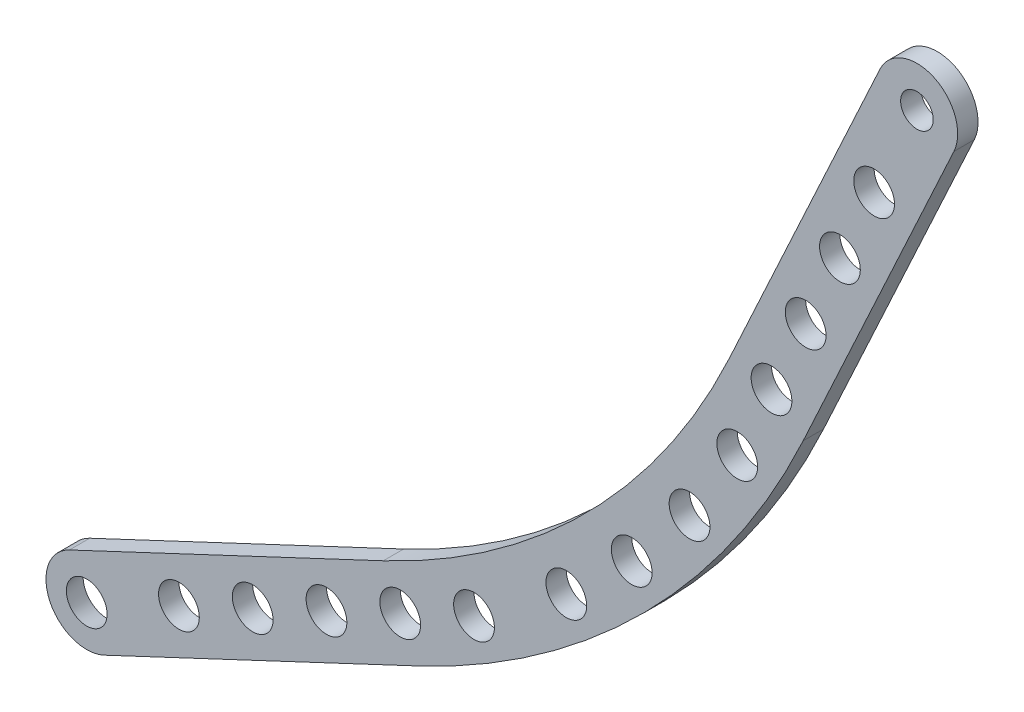
ISO-10303-21;
HEADER;
FILE_DESCRIPTION(('STEP AP214'),'2;1');
FILE_NAME('part.step','',(''),(''),'','','');
FILE_SCHEMA(('AUTOMOTIVE_DESIGN { 1 0 10303 214 1 1 1 1 }'));
ENDSEC;
DATA;
#1=APPLICATION_CONTEXT('core data for automotive mechanical design processes');
#2=APPLICATION_PROTOCOL_DEFINITION('international standard','automotive_design',2000,#1);
#3=PRODUCT_CONTEXT('',#1,'mechanical');
#4=PRODUCT('Part','Part','',(#3));
#5=PRODUCT_RELATED_PRODUCT_CATEGORY('part','',(#4));
#6=PRODUCT_DEFINITION_FORMATION('','',#4);
#7=PRODUCT_DEFINITION_CONTEXT('part definition',#1,'design');
#8=PRODUCT_DEFINITION('design','',#6,#7);
#9=PRODUCT_DEFINITION_SHAPE('','',#8);
#10=(LENGTH_UNIT() NAMED_UNIT(*) SI_UNIT(.MILLI.,.METRE.));
#11=(NAMED_UNIT(*) PLANE_ANGLE_UNIT() SI_UNIT($,.RADIAN.));
#12=(NAMED_UNIT(*) SI_UNIT($,.STERADIAN.) SOLID_ANGLE_UNIT());
#13=UNCERTAINTY_MEASURE_WITH_UNIT(LENGTH_MEASURE(1.E-05),#10,'distance_accuracy_value','');
#14=(GEOMETRIC_REPRESENTATION_CONTEXT(3) GLOBAL_UNCERTAINTY_ASSIGNED_CONTEXT((#13)) GLOBAL_UNIT_ASSIGNED_CONTEXT((#10,
#11,#12)) REPRESENTATION_CONTEXT('',''));
#15=CARTESIAN_POINT('',(0.,0.,0.));
#16=DIRECTION('',(0.,0.,1.));
#17=DIRECTION('',(1.,0.,0.));
#18=AXIS2_PLACEMENT_3D('',#15,#16,#17);
#19=CARTESIAN_POINT('',(-121.695991982311,85.2492767531801,5.));
#20=DIRECTION('',(0.,0.,1.));
#21=DIRECTION('',(1.,0.,0.));
#22=AXIS2_PLACEMENT_3D('',#19,#20,#21);
#23=PLANE('',#22);
#24=CARTESIAN_POINT('',(28.3199968643549,-26.7852290470118,5.));
#25=DIRECTION('',(0.,0.,1.));
#26=DIRECTION('',(1.,0.,0.));
#27=AXIS2_PLACEMENT_3D('',#24,#25,#26);
#28=CIRCLE('',#27,5.00000000000001);
#29=CARTESIAN_POINT('',(33.3199968643549,-26.7852290470118,5.));
#30=VERTEX_POINT('',#29);
#31=EDGE_CURVE('E278',#30,#30,#28,.T.);
#32=ORIENTED_EDGE('',*,*,#31,.F.);
#33=EDGE_LOOP('',(#32));
#34=FACE_BOUND('',#33,.T.);
#35=CARTESIAN_POINT('',(14.1430883994595,-43.6082866281407,5.));
#36=DIRECTION('',(0.,0.,1.));
#37=DIRECTION('',(1.,0.,0.));
#38=AXIS2_PLACEMENT_3D('',#35,#36,#37);
#39=CIRCLE('',#38,4.99999999999999);
#40=CARTESIAN_POINT('',(19.1430883994595,-43.6082866281407,5.));
#41=VERTEX_POINT('',#40);
#42=EDGE_CURVE('E280',#41,#41,#39,.T.);
#43=ORIENTED_EDGE('',*,*,#42,.F.);
#44=EDGE_LOOP('',(#43));
#45=FACE_BOUND('',#44,.T.);
#46=CARTESIAN_POINT('',(-1.90925154087765,-58.6523014659377,5.));
#47=DIRECTION('',(0.,0.,1.));
#48=DIRECTION('',(1.,0.,0.));
#49=AXIS2_PLACEMENT_3D('',#46,#47,#48);
#50=CIRCLE('',#49,5.00000000000001);
#51=CARTESIAN_POINT('',(3.09074845912236,-58.6523014659377,5.));
#52=VERTEX_POINT('',#51);
#53=EDGE_CURVE('E288',#52,#52,#50,.T.);
#54=ORIENTED_EDGE('',*,*,#53,.F.);
#55=EDGE_LOOP('',(#54));
#56=FACE_BOUND('',#55,.T.);
#57=CARTESIAN_POINT('',(-24.5574572514307,-74.6121337966154,5.));
#58=DIRECTION('',(0.,0.,1.));
#59=DIRECTION('',(1.,0.,0.));
#60=AXIS2_PLACEMENT_3D('',#57,#58,#59);
#61=CIRCLE('',#60,5.);
#62=CARTESIAN_POINT('',(-19.5574572514307,-74.6121337966154,5.));
#63=VERTEX_POINT('',#62);
#64=EDGE_CURVE('E294',#63,#63,#61,.T.);
#65=ORIENTED_EDGE('',*,*,#64,.F.);
#66=EDGE_LOOP('',(#65));
#67=FACE_BOUND('',#66,.T.);
#68=CARTESIAN_POINT('',(-42.656786955256,-83.1217909149856,5.));
#69=DIRECTION('',(0.,0.,1.));
#70=DIRECTION('',(1.,0.,0.));
#71=AXIS2_PLACEMENT_3D('',#68,#69,#70);
#72=CIRCLE('',#71,5.);
#73=CARTESIAN_POINT('',(-37.656786955256,-83.1217909149856,5.));
#74=VERTEX_POINT('',#73);
#75=EDGE_CURVE('E300',#74,#74,#72,.T.);
#76=ORIENTED_EDGE('',*,*,#75,.F.);
#77=EDGE_LOOP('',(#76));
#78=FACE_BOUND('',#77,.T.);
#79=CARTESIAN_POINT('',(-60.7561166590812,-91.6314480333558,5.));
#80=DIRECTION('',(0.,0.,1.));
#81=DIRECTION('',(1.,0.,0.));
#82=AXIS2_PLACEMENT_3D('',#79,#80,#81);
#83=CIRCLE('',#82,5.);
#84=CARTESIAN_POINT('',(-55.7561166590812,-91.6314480333558,5.));
#85=VERTEX_POINT('',#84);
#86=EDGE_CURVE('E306',#85,#85,#83,.T.);
#87=ORIENTED_EDGE('',*,*,#86,.F.);
#88=EDGE_LOOP('',(#87));
#89=FACE_BOUND('',#88,.T.);
#90=CARTESIAN_POINT('',(-78.8554463629065,-100.141105151726,5.));
#91=DIRECTION('',(0.,0.,1.));
#92=DIRECTION('',(1.,0.,0.));
#93=AXIS2_PLACEMENT_3D('',#90,#91,#92);
#94=CIRCLE('',#93,5.00000000000001);
#95=CARTESIAN_POINT('',(-73.8554463629065,-100.141105151726,5.));
#96=VERTEX_POINT('',#95);
#97=EDGE_CURVE('E312',#96,#96,#94,.T.);
#98=ORIENTED_EDGE('',*,*,#97,.F.);
#99=EDGE_LOOP('',(#98));
#100=FACE_BOUND('',#99,.T.);
#101=CARTESIAN_POINT('',(-96.9547760667318,-108.650762270096,5.));
#102=DIRECTION('',(0.,0.,1.));
#103=DIRECTION('',(1.,0.,0.));
#104=AXIS2_PLACEMENT_3D('',#101,#102,#103);
#105=CIRCLE('',#104,5.00000000000001);
#106=CARTESIAN_POINT('',(-91.9547760667318,-108.650762270096,5.));
#107=VERTEX_POINT('',#106);
#108=EDGE_CURVE('E318',#107,#107,#105,.T.);
#109=ORIENTED_EDGE('',*,*,#108,.F.);
#110=EDGE_LOOP('',(#109));
#111=FACE_BOUND('',#110,.T.);
#112=CARTESIAN_POINT('',(40.0319313664824,-8.16184078875237,5.));
#113=DIRECTION('',(0.,0.,1.));
#114=DIRECTION('',(1.,0.,0.));
#115=AXIS2_PLACEMENT_3D('',#112,#113,#114);
#116=CIRCLE('',#115,5.);
#117=CARTESIAN_POINT('',(45.0319313664824,-8.16184078875237,5.));
#118=VERTEX_POINT('',#117);
#119=EDGE_CURVE('E324',#118,#118,#116,.T.);
#120=ORIENTED_EDGE('',*,*,#119,.F.);
#121=EDGE_LOOP('',(#120));
#122=FACE_BOUND('',#121,.T.);
#123=CARTESIAN_POINT('',(48.4269201519066,9.99095963687346,5.));
#124=DIRECTION('',(0.,0.,1.));
#125=DIRECTION('',(1.,0.,0.));
#126=AXIS2_PLACEMENT_3D('',#123,#124,#125);
#127=CIRCLE('',#126,5.);
#128=CARTESIAN_POINT('',(53.4269201519066,9.99095963687346,5.));
#129=VERTEX_POINT('',#128);
#130=EDGE_CURVE('E330',#129,#129,#127,.T.);
#131=ORIENTED_EDGE('',*,*,#130,.F.);
#132=EDGE_LOOP('',(#131));
#133=FACE_BOUND('',#132,.T.);
#134=CARTESIAN_POINT('',(56.8219089373308,28.1437600624993,5.));
#135=DIRECTION('',(0.,0.,1.));
#136=DIRECTION('',(1.,0.,0.));
#137=AXIS2_PLACEMENT_3D('',#134,#135,#136);
#138=CIRCLE('',#137,5.);
#139=CARTESIAN_POINT('',(61.8219089373308,28.1437600624993,5.));
#140=VERTEX_POINT('',#139);
#141=EDGE_CURVE('E336',#140,#140,#138,.T.);
#142=ORIENTED_EDGE('',*,*,#141,.F.);
#143=EDGE_LOOP('',(#142));
#144=FACE_BOUND('',#143,.T.);
#145=CARTESIAN_POINT('',(65.216897722755,46.2965604881251,5.));
#146=DIRECTION('',(0.,0.,1.));
#147=DIRECTION('',(1.,0.,0.));
#148=AXIS2_PLACEMENT_3D('',#145,#146,#147);
#149=CIRCLE('',#148,5.00000000000001);
#150=CARTESIAN_POINT('',(70.216897722755,46.2965604881251,5.));
#151=VERTEX_POINT('',#150);
#152=EDGE_CURVE('E342',#151,#151,#149,.T.);
#153=ORIENTED_EDGE('',*,*,#152,.F.);
#154=EDGE_LOOP('',(#153));
#155=FACE_BOUND('',#154,.T.);
#156=CARTESIAN_POINT('',(73.6118865081792,64.449360913751,5.));
#157=DIRECTION('',(0.,0.,1.));
#158=DIRECTION('',(1.,0.,0.));
#159=AXIS2_PLACEMENT_3D('',#156,#157,#158);
#160=CIRCLE('',#159,5.00000000000001);
#161=CARTESIAN_POINT('',(78.6118865081792,64.449360913751,5.));
#162=VERTEX_POINT('',#161);
#163=EDGE_CURVE('E348',#162,#162,#160,.T.);
#164=ORIENTED_EDGE('',*,*,#163,.F.);
#165=EDGE_LOOP('',(#164));
#166=FACE_BOUND('',#165,.T.);
#167=CARTESIAN_POINT('',(84.1056224899598,87.1403614457831,5.));
#168=DIRECTION('',(0.,0.,1.));
#169=DIRECTION('',(1.,0.,0.));
#170=AXIS2_PLACEMENT_3D('',#167,#168,#169);
#171=CIRCLE('',#170,4.00000000000001);
#172=CARTESIAN_POINT('',(88.1056224899598,87.1403614457831,5.));
#173=VERTEX_POINT('',#172);
#174=EDGE_CURVE('E125',#173,#173,#171,.T.);
#175=ORIENTED_EDGE('',*,*,#174,.F.);
#176=EDGE_LOOP('',(#175));
#177=FACE_BOUND('',#176,.T.);
#178=CARTESIAN_POINT('',(-121.695991982311,85.2492767531801,5.));
#179=DIRECTION('',(0.,0.,1.));
#180=DIRECTION('',(1.,0.,0.));
#181=AXIS2_PLACEMENT_3D('',#178,#179,#180);
#182=CIRCLE('',#181,196.);
#183=CARTESIAN_POINT('',(-38.3013522222832,-92.1241543443077,5.));
#184=VERTEX_POINT('',#183);
#185=CARTESIAN_POINT('',(56.2014521888218,2.97838665602096,5.));
#186=VERTEX_POINT('',#185);
#187=EDGE_CURVE('E143',#184,#186,#182,.T.);
#188=ORIENTED_EDGE('',*,*,#187,.T.);
#189=DIRECTION('',(0.419749439271224,0.907640021281286,0.));
#190=VECTOR('',#189,1.);
#191=CARTESIAN_POINT('',(93.1820227027727,82.9428670530709,5.));
#192=LINE('',#191,#190);
#193=CARTESIAN_POINT('',(93.1820227027727,82.9428670530709,5.));
#194=VERTEX_POINT('',#193);
#195=EDGE_CURVE('E120',#186,#194,#192,.T.);
#196=ORIENTED_EDGE('',*,*,#195,.T.);
#197=CARTESIAN_POINT('',(84.1056224899598,87.1403614457831,5.));
#198=DIRECTION('',(0.,0.,1.));
#199=DIRECTION('',(1.,0.,0.));
#200=AXIS2_PLACEMENT_3D('',#197,#198,#199);
#201=CIRCLE('',#200,10.);
#202=CARTESIAN_POINT('',(75.029222277147,91.3378558384954,5.));
#203=VERTEX_POINT('',#202);
#204=EDGE_CURVE('E146',#194,#203,#201,.T.);
#205=ORIENTED_EDGE('',*,*,#204,.T.);
#206=DIRECTION('',(-0.419749439271224,-0.907640021281286,0.));
#207=VECTOR('',#206,1.);
#208=CARTESIAN_POINT('',(75.029222277147,91.3378558384954,5.));
#209=LINE('',#208,#207);
#210=CARTESIAN_POINT('',(38.0486517631959,11.3733754414452,5.));
#211=VERTEX_POINT('',#210);
#212=EDGE_CURVE('E148',#203,#211,#209,.T.);
#213=ORIENTED_EDGE('',*,*,#212,.T.);
#214=CARTESIAN_POINT('',(-121.695991982311,85.24927675318,5.));
#215=DIRECTION('',(0.,0.,-1.));
#216=DIRECTION('',(1.,0.,0.));
#217=AXIS2_PLACEMENT_3D('',#214,#215,#216);
#218=CIRCLE('',#217,176.);
#219=CARTESIAN_POINT('',(-46.8110093406534,-74.0248246404825,5.));
#220=VERTEX_POINT('',#219);
#221=EDGE_CURVE('E150',#211,#220,#218,.T.);
#222=ORIENTED_EDGE('',*,*,#221,.T.);
#223=DIRECTION('',(-0.904966485191263,-0.425482855918511,0.));
#224=VECTOR('',#223,1.);
#225=CARTESIAN_POINT('',(-123.833766755698,-110.238168816146,5.));
#226=LINE('',#225,#224);
#227=CARTESIAN_POINT('',(-123.833766755698,-110.238168816146,5.));
#228=VERTEX_POINT('',#227);
#229=EDGE_CURVE('E152',#220,#228,#226,.T.);
#230=ORIENTED_EDGE('',*,*,#229,.T.);
#231=CARTESIAN_POINT('',(-119.578938196513,-119.287833668059,5.));
#232=DIRECTION('',(0.,0.,1.));
#233=DIRECTION('',(1.,0.,0.));
#234=AXIS2_PLACEMENT_3D('',#231,#232,#233);
#235=CIRCLE('',#234,9.99999999999998);
#236=CARTESIAN_POINT('',(-115.324109637328,-128.337498519972,5.));
#237=VERTEX_POINT('',#236);
#238=EDGE_CURVE('E61',#228,#237,#235,.T.);
#239=ORIENTED_EDGE('',*,*,#238,.T.);
#240=DIRECTION('',(0.904966485191263,0.425482855918511,0.));
#241=VECTOR('',#240,1.);
#242=CARTESIAN_POINT('',(-115.324109637328,-128.337498519972,5.));
#243=LINE('',#242,#241);
#244=EDGE_CURVE('E56',#237,#184,#243,.T.);
#245=ORIENTED_EDGE('',*,*,#244,.T.);
#246=EDGE_LOOP('',(#188,#196,#205,#213,#222,#230,#239,#245));
#247=FACE_BOUND('',#246,.T.);
#248=CARTESIAN_POINT('',(-119.578938196513,-119.287833668059,5.));
#249=DIRECTION('',(0.,0.,1.));
#250=DIRECTION('',(1.,0.,0.));
#251=AXIS2_PLACEMENT_3D('',#248,#249,#250);
#252=CIRCLE('',#251,5.00000000000002);
#253=CARTESIAN_POINT('',(-114.578938196513,-119.287833668059,5.));
#254=VERTEX_POINT('',#253);
#255=EDGE_CURVE('E357',#254,#254,#252,.T.);
#256=ORIENTED_EDGE('',*,*,#255,.F.);
#257=EDGE_LOOP('',(#256));
#258=FACE_BOUND('',#257,.T.);
#259=ADVANCED_FACE('F41',(#34,#45,#56,#67,#78,#89,#100,#111,#122,#133,#144,#155,#166,#177,#247,
#258),#23,.T.);
#260=CARTESIAN_POINT('',(-121.695991982311,85.2492767531801,0.));
#261=DIRECTION('',(0.,0.,1.));
#262=DIRECTION('',(1.,0.,0.));
#263=AXIS2_PLACEMENT_3D('',#260,#261,#262);
#264=PLANE('',#263);
#265=CARTESIAN_POINT('',(28.3199968643549,-26.7852290470118,0.));
#266=DIRECTION('',(0.,0.,1.));
#267=DIRECTION('',(1.,0.,0.));
#268=AXIS2_PLACEMENT_3D('',#265,#266,#267);
#269=CIRCLE('',#268,5.00000000000001);
#270=CARTESIAN_POINT('',(33.3199968643549,-26.7852290470118,0.));
#271=VERTEX_POINT('',#270);
#272=EDGE_CURVE('E276',#271,#271,#269,.T.);
#273=ORIENTED_EDGE('',*,*,#272,.T.);
#274=EDGE_LOOP('',(#273));
#275=FACE_BOUND('',#274,.T.);
#276=CARTESIAN_POINT('',(14.1430883994595,-43.6082866281407,0.));
#277=DIRECTION('',(0.,0.,1.));
#278=DIRECTION('',(1.,0.,0.));
#279=AXIS2_PLACEMENT_3D('',#276,#277,#278);
#280=CIRCLE('',#279,4.99999999999999);
#281=CARTESIAN_POINT('',(19.1430883994595,-43.6082866281407,0.));
#282=VERTEX_POINT('',#281);
#283=EDGE_CURVE('E285',#282,#282,#280,.T.);
#284=ORIENTED_EDGE('',*,*,#283,.T.);
#285=EDGE_LOOP('',(#284));
#286=FACE_BOUND('',#285,.T.);
#287=CARTESIAN_POINT('',(-1.90925154087765,-58.6523014659377,0.));
#288=DIRECTION('',(0.,0.,1.));
#289=DIRECTION('',(1.,0.,0.));
#290=AXIS2_PLACEMENT_3D('',#287,#288,#289);
#291=CIRCLE('',#290,5.00000000000001);
#292=CARTESIAN_POINT('',(3.09074845912236,-58.6523014659377,0.));
#293=VERTEX_POINT('',#292);
#294=EDGE_CURVE('E291',#293,#293,#291,.T.);
#295=ORIENTED_EDGE('',*,*,#294,.T.);
#296=EDGE_LOOP('',(#295));
#297=FACE_BOUND('',#296,.T.);
#298=CARTESIAN_POINT('',(-24.5574572514307,-74.6121337966154,0.));
#299=DIRECTION('',(0.,0.,1.));
#300=DIRECTION('',(1.,0.,0.));
#301=AXIS2_PLACEMENT_3D('',#298,#299,#300);
#302=CIRCLE('',#301,5.);
#303=CARTESIAN_POINT('',(-19.5574572514307,-74.6121337966154,0.));
#304=VERTEX_POINT('',#303);
#305=EDGE_CURVE('E297',#304,#304,#302,.T.);
#306=ORIENTED_EDGE('',*,*,#305,.T.);
#307=EDGE_LOOP('',(#306));
#308=FACE_BOUND('',#307,.T.);
#309=CARTESIAN_POINT('',(-42.656786955256,-83.1217909149856,0.));
#310=DIRECTION('',(0.,0.,1.));
#311=DIRECTION('',(1.,0.,0.));
#312=AXIS2_PLACEMENT_3D('',#309,#310,#311);
#313=CIRCLE('',#312,5.);
#314=CARTESIAN_POINT('',(-37.656786955256,-83.1217909149856,0.));
#315=VERTEX_POINT('',#314);
#316=EDGE_CURVE('E303',#315,#315,#313,.T.);
#317=ORIENTED_EDGE('',*,*,#316,.T.);
#318=EDGE_LOOP('',(#317));
#319=FACE_BOUND('',#318,.T.);
#320=CARTESIAN_POINT('',(-60.7561166590812,-91.6314480333558,0.));
#321=DIRECTION('',(0.,0.,1.));
#322=DIRECTION('',(1.,0.,0.));
#323=AXIS2_PLACEMENT_3D('',#320,#321,#322);
#324=CIRCLE('',#323,5.);
#325=CARTESIAN_POINT('',(-55.7561166590812,-91.6314480333558,0.));
#326=VERTEX_POINT('',#325);
#327=EDGE_CURVE('E309',#326,#326,#324,.T.);
#328=ORIENTED_EDGE('',*,*,#327,.T.);
#329=EDGE_LOOP('',(#328));
#330=FACE_BOUND('',#329,.T.);
#331=CARTESIAN_POINT('',(-78.8554463629065,-100.141105151726,0.));
#332=DIRECTION('',(0.,0.,1.));
#333=DIRECTION('',(1.,0.,0.));
#334=AXIS2_PLACEMENT_3D('',#331,#332,#333);
#335=CIRCLE('',#334,5.00000000000001);
#336=CARTESIAN_POINT('',(-73.8554463629065,-100.141105151726,0.));
#337=VERTEX_POINT('',#336);
#338=EDGE_CURVE('E315',#337,#337,#335,.T.);
#339=ORIENTED_EDGE('',*,*,#338,.T.);
#340=EDGE_LOOP('',(#339));
#341=FACE_BOUND('',#340,.T.);
#342=CARTESIAN_POINT('',(-96.9547760667318,-108.650762270096,0.));
#343=DIRECTION('',(0.,0.,1.));
#344=DIRECTION('',(1.,0.,0.));
#345=AXIS2_PLACEMENT_3D('',#342,#343,#344);
#346=CIRCLE('',#345,5.00000000000001);
#347=CARTESIAN_POINT('',(-91.9547760667318,-108.650762270096,0.));
#348=VERTEX_POINT('',#347);
#349=EDGE_CURVE('E321',#348,#348,#346,.T.);
#350=ORIENTED_EDGE('',*,*,#349,.T.);
#351=EDGE_LOOP('',(#350));
#352=FACE_BOUND('',#351,.T.);
#353=CARTESIAN_POINT('',(40.0319313664824,-8.16184078875237,0.));
#354=DIRECTION('',(0.,0.,1.));
#355=DIRECTION('',(1.,0.,0.));
#356=AXIS2_PLACEMENT_3D('',#353,#354,#355);
#357=CIRCLE('',#356,5.);
#358=CARTESIAN_POINT('',(45.0319313664824,-8.16184078875237,0.));
#359=VERTEX_POINT('',#358);
#360=EDGE_CURVE('E327',#359,#359,#357,.T.);
#361=ORIENTED_EDGE('',*,*,#360,.T.);
#362=EDGE_LOOP('',(#361));
#363=FACE_BOUND('',#362,.T.);
#364=CARTESIAN_POINT('',(48.4269201519066,9.99095963687346,0.));
#365=DIRECTION('',(0.,0.,1.));
#366=DIRECTION('',(1.,0.,0.));
#367=AXIS2_PLACEMENT_3D('',#364,#365,#366);
#368=CIRCLE('',#367,5.);
#369=CARTESIAN_POINT('',(53.4269201519066,9.99095963687346,0.));
#370=VERTEX_POINT('',#369);
#371=EDGE_CURVE('E333',#370,#370,#368,.T.);
#372=ORIENTED_EDGE('',*,*,#371,.T.);
#373=EDGE_LOOP('',(#372));
#374=FACE_BOUND('',#373,.T.);
#375=CARTESIAN_POINT('',(56.8219089373308,28.1437600624993,0.));
#376=DIRECTION('',(0.,0.,1.));
#377=DIRECTION('',(1.,0.,0.));
#378=AXIS2_PLACEMENT_3D('',#375,#376,#377);
#379=CIRCLE('',#378,5.);
#380=CARTESIAN_POINT('',(61.8219089373308,28.1437600624993,0.));
#381=VERTEX_POINT('',#380);
#382=EDGE_CURVE('E339',#381,#381,#379,.T.);
#383=ORIENTED_EDGE('',*,*,#382,.T.);
#384=EDGE_LOOP('',(#383));
#385=FACE_BOUND('',#384,.T.);
#386=CARTESIAN_POINT('',(65.216897722755,46.2965604881251,0.));
#387=DIRECTION('',(0.,0.,1.));
#388=DIRECTION('',(1.,0.,0.));
#389=AXIS2_PLACEMENT_3D('',#386,#387,#388);
#390=CIRCLE('',#389,5.00000000000001);
#391=CARTESIAN_POINT('',(70.216897722755,46.2965604881251,0.));
#392=VERTEX_POINT('',#391);
#393=EDGE_CURVE('E345',#392,#392,#390,.T.);
#394=ORIENTED_EDGE('',*,*,#393,.T.);
#395=EDGE_LOOP('',(#394));
#396=FACE_BOUND('',#395,.T.);
#397=CARTESIAN_POINT('',(73.6118865081792,64.449360913751,0.));
#398=DIRECTION('',(0.,0.,1.));
#399=DIRECTION('',(1.,0.,0.));
#400=AXIS2_PLACEMENT_3D('',#397,#398,#399);
#401=CIRCLE('',#400,5.00000000000001);
#402=CARTESIAN_POINT('',(78.6118865081792,64.449360913751,0.));
#403=VERTEX_POINT('',#402);
#404=EDGE_CURVE('E351',#403,#403,#401,.T.);
#405=ORIENTED_EDGE('',*,*,#404,.T.);
#406=EDGE_LOOP('',(#405));
#407=FACE_BOUND('',#406,.T.);
#408=CARTESIAN_POINT('',(84.1056224899598,87.1403614457831,0.));
#409=DIRECTION('',(0.,0.,1.));
#410=DIRECTION('',(1.,0.,0.));
#411=AXIS2_PLACEMENT_3D('',#408,#409,#410);
#412=CIRCLE('',#411,4.00000000000001);
#413=CARTESIAN_POINT('',(88.1056224899598,87.1403614457831,0.));
#414=VERTEX_POINT('',#413);
#415=EDGE_CURVE('E128',#414,#414,#412,.T.);
#416=ORIENTED_EDGE('',*,*,#415,.T.);
#417=EDGE_LOOP('',(#416));
#418=FACE_BOUND('',#417,.T.);
#419=CARTESIAN_POINT('',(-121.695991982311,85.2492767531801,0.));
#420=DIRECTION('',(0.,0.,1.));
#421=DIRECTION('',(1.,0.,0.));
#422=AXIS2_PLACEMENT_3D('',#419,#420,#421);
#423=CIRCLE('',#422,196.);
#424=CARTESIAN_POINT('',(-38.3013522222832,-92.1241543443077,0.));
#425=VERTEX_POINT('',#424);
#426=CARTESIAN_POINT('',(56.2014521888218,2.97838665602096,0.));
#427=VERTEX_POINT('',#426);
#428=EDGE_CURVE('E111',#425,#427,#423,.T.);
#429=ORIENTED_EDGE('',*,*,#428,.F.);
#430=DIRECTION('',(0.904966485191263,0.425482855918511,0.));
#431=VECTOR('',#430,1.);
#432=CARTESIAN_POINT('',(-115.324109637328,-128.337498519972,0.));
#433=LINE('',#432,#431);
#434=CARTESIAN_POINT('',(-115.324109637328,-128.337498519972,0.));
#435=VERTEX_POINT('',#434);
#436=EDGE_CURVE('E141',#435,#425,#433,.T.);
#437=ORIENTED_EDGE('',*,*,#436,.F.);
#438=CARTESIAN_POINT('',(-119.578938196513,-119.287833668059,0.));
#439=DIRECTION('',(0.,0.,1.));
#440=DIRECTION('',(1.,0.,0.));
#441=AXIS2_PLACEMENT_3D('',#438,#439,#440);
#442=CIRCLE('',#441,9.99999999999998);
#443=CARTESIAN_POINT('',(-123.833766755698,-110.238168816146,0.));
#444=VERTEX_POINT('',#443);
#445=EDGE_CURVE('E139',#444,#435,#442,.T.);
#446=ORIENTED_EDGE('',*,*,#445,.F.);
#447=DIRECTION('',(-0.904966485191263,-0.425482855918511,0.));
#448=VECTOR('',#447,1.);
#449=CARTESIAN_POINT('',(-123.833766755698,-110.238168816146,0.));
#450=LINE('',#449,#448);
#451=CARTESIAN_POINT('',(-46.8110093406534,-74.0248246404825,0.));
#452=VERTEX_POINT('',#451);
#453=EDGE_CURVE('E137',#452,#444,#450,.T.);
#454=ORIENTED_EDGE('',*,*,#453,.F.);
#455=CARTESIAN_POINT('',(-121.695991982311,85.24927675318,0.));
#456=DIRECTION('',(0.,0.,-1.));
#457=DIRECTION('',(1.,0.,0.));
#458=AXIS2_PLACEMENT_3D('',#455,#456,#457);
#459=CIRCLE('',#458,176.);
#460=CARTESIAN_POINT('',(38.0486517631959,11.3733754414452,0.));
#461=VERTEX_POINT('',#460);
#462=EDGE_CURVE('E135',#461,#452,#459,.T.);
#463=ORIENTED_EDGE('',*,*,#462,.F.);
#464=DIRECTION('',(-0.419749439271224,-0.907640021281286,0.));
#465=VECTOR('',#464,1.);
#466=CARTESIAN_POINT('',(75.029222277147,91.3378558384954,0.));
#467=LINE('',#466,#465);
#468=CARTESIAN_POINT('',(75.029222277147,91.3378558384954,0.));
#469=VERTEX_POINT('',#468);
#470=EDGE_CURVE('E133',#469,#461,#467,.T.);
#471=ORIENTED_EDGE('',*,*,#470,.F.);
#472=CARTESIAN_POINT('',(84.1056224899598,87.1403614457831,0.));
#473=DIRECTION('',(0.,0.,1.));
#474=DIRECTION('',(1.,0.,0.));
#475=AXIS2_PLACEMENT_3D('',#472,#473,#474);
#476=CIRCLE('',#475,10.);
#477=CARTESIAN_POINT('',(93.1820227027727,82.9428670530709,0.));
#478=VERTEX_POINT('',#477);
#479=EDGE_CURVE('E113',#478,#469,#476,.T.);
#480=ORIENTED_EDGE('',*,*,#479,.F.);
#481=DIRECTION('',(0.419749439271224,0.907640021281286,0.));
#482=VECTOR('',#481,1.);
#483=CARTESIAN_POINT('',(93.1820227027727,82.9428670530709,0.));
#484=LINE('',#483,#482);
#485=EDGE_CURVE('E106',#427,#478,#484,.T.);
#486=ORIENTED_EDGE('',*,*,#485,.F.);
#487=EDGE_LOOP('',(#429,#437,#446,#454,#463,#471,#480,#486));
#488=FACE_BOUND('',#487,.T.);
#489=CARTESIAN_POINT('',(-119.578938196513,-119.287833668059,0.));
#490=DIRECTION('',(0.,0.,1.));
#491=DIRECTION('',(1.,0.,0.));
#492=AXIS2_PLACEMENT_3D('',#489,#490,#491);
#493=CIRCLE('',#492,5.88163490354233);
#494=CARTESIAN_POINT('',(-113.697303292971,-119.287833668059,0.));
#495=VERTEX_POINT('',#494);
#496=EDGE_CURVE('E354',#495,#495,#493,.T.);
#497=ORIENTED_EDGE('',*,*,#496,.T.);
#498=EDGE_LOOP('',(#497));
#499=FACE_BOUND('',#498,.T.);
#500=ADVANCED_FACE('F107',(#275,#286,#297,#308,#319,#330,#341,#352,#363,#374,#385,#396,#407,
#418,#488,#499),#264,.F.);
#501=CARTESIAN_POINT('',(-121.695991982311,85.2492767531801,5.));
#502=DIRECTION('',(0.,0.,-1.));
#503=DIRECTION('',(-1.,0.,0.));
#504=AXIS2_PLACEMENT_3D('',#501,#502,#503);
#505=CYLINDRICAL_SURFACE('',#504,196.);
#506=ORIENTED_EDGE('',*,*,#428,.T.);
#507=DIRECTION('',(0.,0.,-1.));
#508=VECTOR('',#507,1.);
#509=CARTESIAN_POINT('',(56.2014521888218,2.97838665602096,5.));
#510=LINE('',#509,#508);
#511=EDGE_CURVE('E11',#186,#427,#510,.T.);
#512=ORIENTED_EDGE('',*,*,#511,.F.);
#513=ORIENTED_EDGE('',*,*,#187,.F.);
#514=DIRECTION('',(0.,0.,-1.));
#515=VECTOR('',#514,1.);
#516=CARTESIAN_POINT('',(-38.3013522222832,-92.1241543443077,5.));
#517=LINE('',#516,#515);
#518=EDGE_CURVE('E124',#184,#425,#517,.T.);
#519=ORIENTED_EDGE('',*,*,#518,.T.);
#520=EDGE_LOOP('',(#506,#512,#513,#519));
#521=FACE_BOUND('',#520,.T.);
#522=ADVANCED_FACE('F43',(#521),#505,.T.);
#523=CARTESIAN_POINT('',(93.1820227027727,82.9428670530709,5.));
#524=DIRECTION('',(-0.907640021281286,0.419749439271224,0.));
#525=DIRECTION('',(-0.419749439271224,-0.907640021281286,0.));
#526=AXIS2_PLACEMENT_3D('',#523,#524,#525);
#527=PLANE('',#526);
#528=ORIENTED_EDGE('',*,*,#485,.T.);
#529=DIRECTION('',(0.,0.,-1.));
#530=VECTOR('',#529,1.);
#531=CARTESIAN_POINT('',(93.1820227027727,82.9428670530709,5.));
#532=LINE('',#531,#530);
#533=EDGE_CURVE('E49',#194,#478,#532,.T.);
#534=ORIENTED_EDGE('',*,*,#533,.F.);
#535=ORIENTED_EDGE('',*,*,#195,.F.);
#536=ORIENTED_EDGE('',*,*,#511,.T.);
#537=EDGE_LOOP('',(#528,#534,#535,#536));
#538=FACE_BOUND('',#537,.T.);
#539=ADVANCED_FACE('F119',(#538),#527,.F.);
#540=CARTESIAN_POINT('',(84.1056224899598,87.1403614457831,5.));
#541=DIRECTION('',(0.,0.,-1.));
#542=DIRECTION('',(-1.,0.,0.));
#543=AXIS2_PLACEMENT_3D('',#540,#541,#542);
#544=CYLINDRICAL_SURFACE('',#543,10.);
#545=ORIENTED_EDGE('',*,*,#479,.T.);
#546=DIRECTION('',(0.,0.,-1.));
#547=VECTOR('',#546,1.);
#548=CARTESIAN_POINT('',(75.029222277147,91.3378558384954,5.));
#549=LINE('',#548,#547);
#550=EDGE_CURVE('E169',#203,#469,#549,.T.);
#551=ORIENTED_EDGE('',*,*,#550,.F.);
#552=ORIENTED_EDGE('',*,*,#204,.F.);
#553=ORIENTED_EDGE('',*,*,#533,.T.);
#554=EDGE_LOOP('',(#545,#551,#552,#553));
#555=FACE_BOUND('',#554,.T.);
#556=ADVANCED_FACE('F173',(#555),#544,.T.);
#557=CARTESIAN_POINT('',(75.029222277147,91.3378558384954,5.));
#558=DIRECTION('',(0.907640021281286,-0.419749439271224,0.));
#559=DIRECTION('',(0.419749439271224,0.907640021281286,0.));
#560=AXIS2_PLACEMENT_3D('',#557,#558,#559);
#561=PLANE('',#560);
#562=ORIENTED_EDGE('',*,*,#470,.T.);
#563=DIRECTION('',(0.,0.,-1.));
#564=VECTOR('',#563,1.);
#565=CARTESIAN_POINT('',(38.0486517631959,11.3733754414452,5.));
#566=LINE('',#565,#564);
#567=EDGE_CURVE('E166',#211,#461,#566,.T.);
#568=ORIENTED_EDGE('',*,*,#567,.F.);
#569=ORIENTED_EDGE('',*,*,#212,.F.);
#570=ORIENTED_EDGE('',*,*,#550,.T.);
#571=EDGE_LOOP('',(#562,#568,#569,#570));
#572=FACE_BOUND('',#571,.T.);
#573=ADVANCED_FACE('F181',(#572),#561,.F.);
#574=CARTESIAN_POINT('',(-121.695991982311,85.24927675318,5.));
#575=DIRECTION('',(0.,0.,-1.));
#576=DIRECTION('',(-1.,0.,0.));
#577=AXIS2_PLACEMENT_3D('',#574,#575,#576);
#578=CYLINDRICAL_SURFACE('',#577,176.);
#579=ORIENTED_EDGE('',*,*,#462,.T.);
#580=DIRECTION('',(0.,0.,-1.));
#581=VECTOR('',#580,1.);
#582=CARTESIAN_POINT('',(-46.8110093406534,-74.0248246404825,5.));
#583=LINE('',#582,#581);
#584=EDGE_CURVE('E163',#220,#452,#583,.T.);
#585=ORIENTED_EDGE('',*,*,#584,.F.);
#586=ORIENTED_EDGE('',*,*,#221,.F.);
#587=ORIENTED_EDGE('',*,*,#567,.T.);
#588=EDGE_LOOP('',(#579,#585,#586,#587));
#589=FACE_BOUND('',#588,.T.);
#590=ADVANCED_FACE('F184',(#589),#578,.F.);
#591=CARTESIAN_POINT('',(-123.833766755698,-110.238168816146,5.));
#592=DIRECTION('',(0.425482855918511,-0.904966485191263,0.));
#593=DIRECTION('',(0.904966485191263,0.425482855918511,0.));
#594=AXIS2_PLACEMENT_3D('',#591,#592,#593);
#595=PLANE('',#594);
#596=ORIENTED_EDGE('',*,*,#453,.T.);
#597=DIRECTION('',(0.,0.,-1.));
#598=VECTOR('',#597,1.);
#599=CARTESIAN_POINT('',(-123.833766755698,-110.238168816146,5.));
#600=LINE('',#599,#598);
#601=EDGE_CURVE('E160',#228,#444,#600,.T.);
#602=ORIENTED_EDGE('',*,*,#601,.F.);
#603=ORIENTED_EDGE('',*,*,#229,.F.);
#604=ORIENTED_EDGE('',*,*,#584,.T.);
#605=EDGE_LOOP('',(#596,#602,#603,#604));
#606=FACE_BOUND('',#605,.T.);
#607=ADVANCED_FACE('F189',(#606),#595,.F.);
#608=CARTESIAN_POINT('',(-119.578938196513,-119.287833668059,5.));
#609=DIRECTION('',(0.,0.,-1.));
#610=DIRECTION('',(-1.,0.,0.));
#611=AXIS2_PLACEMENT_3D('',#608,#609,#610);
#612=CYLINDRICAL_SURFACE('',#611,9.99999999999998);
#613=ORIENTED_EDGE('',*,*,#445,.T.);
#614=DIRECTION('',(0.,0.,-1.));
#615=VECTOR('',#614,1.);
#616=CARTESIAN_POINT('',(-115.324109637328,-128.337498519972,5.));
#617=LINE('',#616,#615);
#618=EDGE_CURVE('E157',#237,#435,#617,.T.);
#619=ORIENTED_EDGE('',*,*,#618,.F.);
#620=ORIENTED_EDGE('',*,*,#238,.F.);
#621=ORIENTED_EDGE('',*,*,#601,.T.);
#622=EDGE_LOOP('',(#613,#619,#620,#621));
#623=FACE_BOUND('',#622,.T.);
#624=ADVANCED_FACE('F192',(#623),#612,.T.);
#625=CARTESIAN_POINT('',(-115.324109637328,-128.337498519972,5.));
#626=DIRECTION('',(-0.425482855918511,0.904966485191263,0.));
#627=DIRECTION('',(-0.904966485191263,-0.425482855918511,0.));
#628=AXIS2_PLACEMENT_3D('',#625,#626,#627);
#629=PLANE('',#628);
#630=ORIENTED_EDGE('',*,*,#436,.T.);
#631=ORIENTED_EDGE('',*,*,#518,.F.);
#632=ORIENTED_EDGE('',*,*,#244,.F.);
#633=ORIENTED_EDGE('',*,*,#618,.T.);
#634=EDGE_LOOP('',(#630,#631,#632,#633));
#635=FACE_BOUND('',#634,.T.);
#636=ADVANCED_FACE('F194',(#635),#629,.F.);
#637=CARTESIAN_POINT('',(84.1056224899598,87.1403614457831,5.));
#638=DIRECTION('',(0.,0.,-1.));
#639=DIRECTION('',(-1.,0.,0.));
#640=AXIS2_PLACEMENT_3D('',#637,#638,#639);
#641=CYLINDRICAL_SURFACE('',#640,4.00000000000001);
#642=ORIENTED_EDGE('',*,*,#174,.T.);
#643=EDGE_LOOP('',(#642));
#644=FACE_BOUND('',#643,.T.);
#645=ORIENTED_EDGE('',*,*,#415,.F.);
#646=EDGE_LOOP('',(#645));
#647=FACE_BOUND('',#646,.T.);
#648=ADVANCED_FACE('F196',(#644,#647),#641,.F.);
#649=CARTESIAN_POINT('',(-119.578938196513,-119.287833668059,0.));
#650=DIRECTION('',(0.,0.,-1.));
#651=DIRECTION('',(-1.,0.,0.));
#652=AXIS2_PLACEMENT_3D('',#649,#650,#651);
#653=CONICAL_SURFACE('',#652,5.88163490354233,0.17453292519943);
#654=ORIENTED_EDGE('',*,*,#255,.T.);
#655=EDGE_LOOP('',(#654));
#656=FACE_BOUND('',#655,.T.);
#657=ORIENTED_EDGE('',*,*,#496,.F.);
#658=EDGE_LOOP('',(#657));
#659=FACE_BOUND('',#658,.T.);
#660=ADVANCED_FACE('F202',(#656,#659),#653,.F.);
#661=CARTESIAN_POINT('',(73.6118865081792,64.449360913751,0.));
#662=DIRECTION('',(0.,0.,1.));
#663=DIRECTION('',(1.,0.,0.));
#664=AXIS2_PLACEMENT_3D('',#661,#662,#663);
#665=CYLINDRICAL_SURFACE('',#664,5.00000000000001);
#666=ORIENTED_EDGE('',*,*,#404,.F.);
#667=EDGE_LOOP('',(#666));
#668=FACE_BOUND('',#667,.T.);
#669=ORIENTED_EDGE('',*,*,#163,.T.);
#670=EDGE_LOOP('',(#669));
#671=FACE_BOUND('',#670,.T.);
#672=ADVANCED_FACE('F219',(#668,#671),#665,.F.);
#673=CARTESIAN_POINT('',(65.216897722755,46.2965604881251,0.));
#674=DIRECTION('',(0.,0.,1.));
#675=DIRECTION('',(1.,0.,0.));
#676=AXIS2_PLACEMENT_3D('',#673,#674,#675);
#677=CYLINDRICAL_SURFACE('',#676,5.00000000000001);
#678=ORIENTED_EDGE('',*,*,#393,.F.);
#679=EDGE_LOOP('',(#678));
#680=FACE_BOUND('',#679,.T.);
#681=ORIENTED_EDGE('',*,*,#152,.T.);
#682=EDGE_LOOP('',(#681));
#683=FACE_BOUND('',#682,.T.);
#684=ADVANCED_FACE('F223',(#680,#683),#677,.F.);
#685=CARTESIAN_POINT('',(56.8219089373308,28.1437600624993,0.));
#686=DIRECTION('',(0.,0.,1.));
#687=DIRECTION('',(1.,0.,0.));
#688=AXIS2_PLACEMENT_3D('',#685,#686,#687);
#689=CYLINDRICAL_SURFACE('',#688,5.);
#690=ORIENTED_EDGE('',*,*,#382,.F.);
#691=EDGE_LOOP('',(#690));
#692=FACE_BOUND('',#691,.T.);
#693=ORIENTED_EDGE('',*,*,#141,.T.);
#694=EDGE_LOOP('',(#693));
#695=FACE_BOUND('',#694,.T.);
#696=ADVANCED_FACE('F227',(#692,#695),#689,.F.);
#697=CARTESIAN_POINT('',(48.4269201519066,9.99095963687346,0.));
#698=DIRECTION('',(0.,0.,1.));
#699=DIRECTION('',(1.,0.,0.));
#700=AXIS2_PLACEMENT_3D('',#697,#698,#699);
#701=CYLINDRICAL_SURFACE('',#700,5.);
#702=ORIENTED_EDGE('',*,*,#371,.F.);
#703=EDGE_LOOP('',(#702));
#704=FACE_BOUND('',#703,.T.);
#705=ORIENTED_EDGE('',*,*,#130,.T.);
#706=EDGE_LOOP('',(#705));
#707=FACE_BOUND('',#706,.T.);
#708=ADVANCED_FACE('F231',(#704,#707),#701,.F.);
#709=CARTESIAN_POINT('',(40.0319313664824,-8.16184078875237,0.));
#710=DIRECTION('',(0.,0.,1.));
#711=DIRECTION('',(1.,0.,0.));
#712=AXIS2_PLACEMENT_3D('',#709,#710,#711);
#713=CYLINDRICAL_SURFACE('',#712,5.);
#714=ORIENTED_EDGE('',*,*,#360,.F.);
#715=EDGE_LOOP('',(#714));
#716=FACE_BOUND('',#715,.T.);
#717=ORIENTED_EDGE('',*,*,#119,.T.);
#718=EDGE_LOOP('',(#717));
#719=FACE_BOUND('',#718,.T.);
#720=ADVANCED_FACE('F235',(#716,#719),#713,.F.);
#721=CARTESIAN_POINT('',(-96.9547760667318,-108.650762270096,0.));
#722=DIRECTION('',(0.,0.,1.));
#723=DIRECTION('',(1.,0.,0.));
#724=AXIS2_PLACEMENT_3D('',#721,#722,#723);
#725=CYLINDRICAL_SURFACE('',#724,5.00000000000001);
#726=ORIENTED_EDGE('',*,*,#349,.F.);
#727=EDGE_LOOP('',(#726));
#728=FACE_BOUND('',#727,.T.);
#729=ORIENTED_EDGE('',*,*,#108,.T.);
#730=EDGE_LOOP('',(#729));
#731=FACE_BOUND('',#730,.T.);
#732=ADVANCED_FACE('F239',(#728,#731),#725,.F.);
#733=CARTESIAN_POINT('',(-78.8554463629065,-100.141105151726,0.));
#734=DIRECTION('',(0.,0.,1.));
#735=DIRECTION('',(1.,0.,0.));
#736=AXIS2_PLACEMENT_3D('',#733,#734,#735);
#737=CYLINDRICAL_SURFACE('',#736,5.00000000000001);
#738=ORIENTED_EDGE('',*,*,#338,.F.);
#739=EDGE_LOOP('',(#738));
#740=FACE_BOUND('',#739,.T.);
#741=ORIENTED_EDGE('',*,*,#97,.T.);
#742=EDGE_LOOP('',(#741));
#743=FACE_BOUND('',#742,.T.);
#744=ADVANCED_FACE('F243',(#740,#743),#737,.F.);
#745=CARTESIAN_POINT('',(-60.7561166590812,-91.6314480333558,0.));
#746=DIRECTION('',(0.,0.,1.));
#747=DIRECTION('',(1.,0.,0.));
#748=AXIS2_PLACEMENT_3D('',#745,#746,#747);
#749=CYLINDRICAL_SURFACE('',#748,5.);
#750=ORIENTED_EDGE('',*,*,#327,.F.);
#751=EDGE_LOOP('',(#750));
#752=FACE_BOUND('',#751,.T.);
#753=ORIENTED_EDGE('',*,*,#86,.T.);
#754=EDGE_LOOP('',(#753));
#755=FACE_BOUND('',#754,.T.);
#756=ADVANCED_FACE('F247',(#752,#755),#749,.F.);
#757=CARTESIAN_POINT('',(-42.656786955256,-83.1217909149856,0.));
#758=DIRECTION('',(0.,0.,1.));
#759=DIRECTION('',(1.,0.,0.));
#760=AXIS2_PLACEMENT_3D('',#757,#758,#759);
#761=CYLINDRICAL_SURFACE('',#760,5.);
#762=ORIENTED_EDGE('',*,*,#316,.F.);
#763=EDGE_LOOP('',(#762));
#764=FACE_BOUND('',#763,.T.);
#765=ORIENTED_EDGE('',*,*,#75,.T.);
#766=EDGE_LOOP('',(#765));
#767=FACE_BOUND('',#766,.T.);
#768=ADVANCED_FACE('F251',(#764,#767),#761,.F.);
#769=CARTESIAN_POINT('',(-24.5574572514307,-74.6121337966154,0.));
#770=DIRECTION('',(0.,0.,1.));
#771=DIRECTION('',(1.,0.,0.));
#772=AXIS2_PLACEMENT_3D('',#769,#770,#771);
#773=CYLINDRICAL_SURFACE('',#772,5.);
#774=ORIENTED_EDGE('',*,*,#305,.F.);
#775=EDGE_LOOP('',(#774));
#776=FACE_BOUND('',#775,.T.);
#777=ORIENTED_EDGE('',*,*,#64,.T.);
#778=EDGE_LOOP('',(#777));
#779=FACE_BOUND('',#778,.T.);
#780=ADVANCED_FACE('F255',(#776,#779),#773,.F.);
#781=CARTESIAN_POINT('',(-1.90925154087765,-58.6523014659377,0.));
#782=DIRECTION('',(0.,0.,1.));
#783=DIRECTION('',(1.,0.,0.));
#784=AXIS2_PLACEMENT_3D('',#781,#782,#783);
#785=CYLINDRICAL_SURFACE('',#784,5.00000000000001);
#786=ORIENTED_EDGE('',*,*,#294,.F.);
#787=EDGE_LOOP('',(#786));
#788=FACE_BOUND('',#787,.T.);
#789=ORIENTED_EDGE('',*,*,#53,.T.);
#790=EDGE_LOOP('',(#789));
#791=FACE_BOUND('',#790,.T.);
#792=ADVANCED_FACE('F259',(#788,#791),#785,.F.);
#793=CARTESIAN_POINT('',(14.1430883994595,-43.6082866281407,0.));
#794=DIRECTION('',(0.,0.,1.));
#795=DIRECTION('',(1.,0.,0.));
#796=AXIS2_PLACEMENT_3D('',#793,#794,#795);
#797=CYLINDRICAL_SURFACE('',#796,4.99999999999999);
#798=ORIENTED_EDGE('',*,*,#283,.F.);
#799=EDGE_LOOP('',(#798));
#800=FACE_BOUND('',#799,.T.);
#801=ORIENTED_EDGE('',*,*,#42,.T.);
#802=EDGE_LOOP('',(#801));
#803=FACE_BOUND('',#802,.T.);
#804=ADVANCED_FACE('F263',(#800,#803),#797,.F.);
#805=CARTESIAN_POINT('',(28.3199968643549,-26.7852290470118,0.));
#806=DIRECTION('',(0.,0.,1.));
#807=DIRECTION('',(1.,0.,0.));
#808=AXIS2_PLACEMENT_3D('',#805,#806,#807);
#809=CYLINDRICAL_SURFACE('',#808,5.00000000000001);
#810=ORIENTED_EDGE('',*,*,#272,.F.);
#811=EDGE_LOOP('',(#810));
#812=FACE_BOUND('',#811,.T.);
#813=ORIENTED_EDGE('',*,*,#31,.T.);
#814=EDGE_LOOP('',(#813));
#815=FACE_BOUND('',#814,.T.);
#816=ADVANCED_FACE('F267',(#812,#815),#809,.F.);
#817=CLOSED_SHELL('',(#259,#500,#522,#539,#556,#573,#590,#607,#624,#636,#648,#660,#672,#684,
#696,#708,#720,#732,#744,#756,#768,#780,#792,#804,#816));
#818=MANIFOLD_SOLID_BREP('B2',#817);
#819=ADVANCED_BREP_SHAPE_REPRESENTATION('',(#18,#818),#14);
#820=SHAPE_DEFINITION_REPRESENTATION(#9,#819);
ENDSEC;
END-ISO-10303-21;
